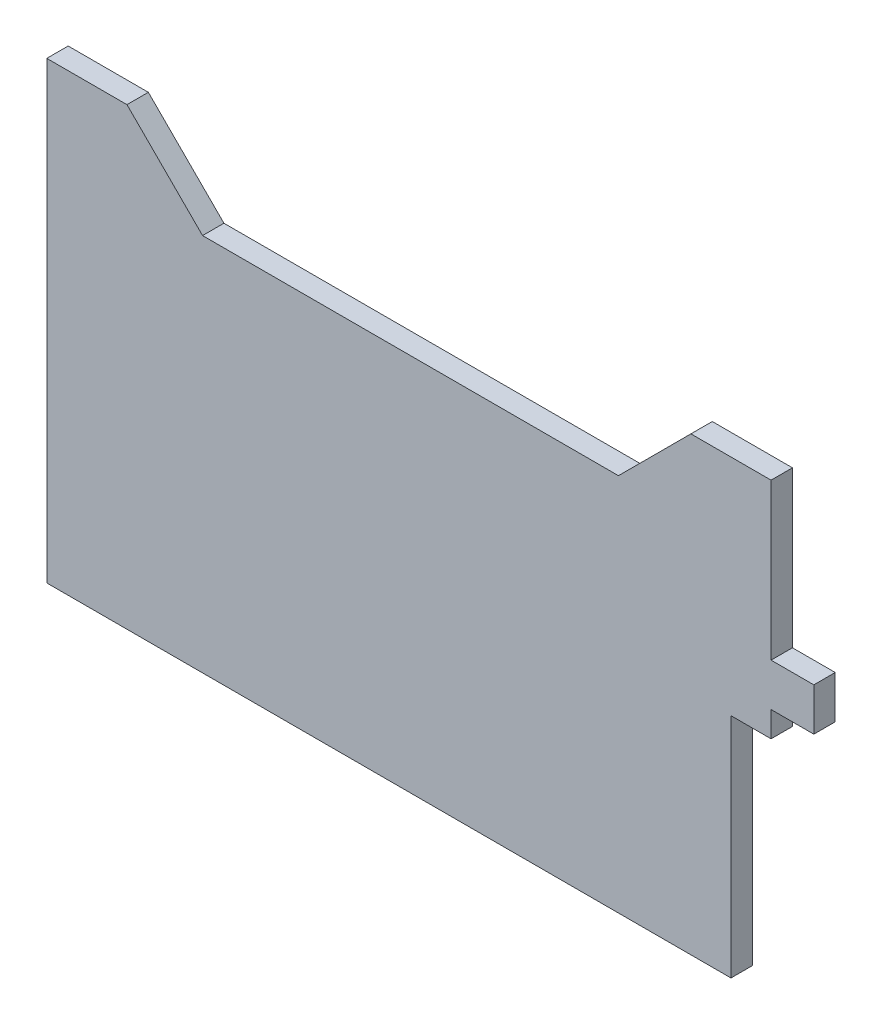
ISO-10303-21;
HEADER;
FILE_DESCRIPTION(('STEP AP214'),'2;1');
FILE_NAME('part.step','',(''),(''),'','','');
FILE_SCHEMA(('AUTOMOTIVE_DESIGN { 1 0 10303 214 1 1 1 1 }'));
ENDSEC;
DATA;
#1=APPLICATION_CONTEXT('core data for automotive mechanical design processes');
#2=APPLICATION_PROTOCOL_DEFINITION('international standard','automotive_design',2000,#1);
#3=PRODUCT_CONTEXT('',#1,'mechanical');
#4=PRODUCT('Part','Part','',(#3));
#5=PRODUCT_RELATED_PRODUCT_CATEGORY('part','',(#4));
#6=PRODUCT_DEFINITION_FORMATION('','',#4);
#7=PRODUCT_DEFINITION_CONTEXT('part definition',#1,'design');
#8=PRODUCT_DEFINITION('design','',#6,#7);
#9=PRODUCT_DEFINITION_SHAPE('','',#8);
#10=(LENGTH_UNIT() NAMED_UNIT(*) SI_UNIT(.MILLI.,.METRE.));
#11=(NAMED_UNIT(*) PLANE_ANGLE_UNIT() SI_UNIT($,.RADIAN.));
#12=(NAMED_UNIT(*) SI_UNIT($,.STERADIAN.) SOLID_ANGLE_UNIT());
#13=UNCERTAINTY_MEASURE_WITH_UNIT(LENGTH_MEASURE(1.E-05),#10,'distance_accuracy_value','');
#14=(GEOMETRIC_REPRESENTATION_CONTEXT(3) GLOBAL_UNCERTAINTY_ASSIGNED_CONTEXT((#13)) GLOBAL_UNIT_ASSIGNED_CONTEXT((#10,
#11,#12)) REPRESENTATION_CONTEXT('',''));
#15=CARTESIAN_POINT('',(0.,0.,0.));
#16=DIRECTION('',(0.,0.,1.));
#17=DIRECTION('',(1.,0.,0.));
#18=AXIS2_PLACEMENT_3D('',#15,#16,#17);
#19=CARTESIAN_POINT('',(62.5,19.450893004236,4.));
#20=DIRECTION('',(0.,1.,0.));
#21=DIRECTION('',(0.,0.,1.));
#22=AXIS2_PLACEMENT_3D('',#19,#20,#21);
#23=PLANE('',#22);
#24=DIRECTION('',(1.,0.,0.));
#25=VECTOR('',#24,1.);
#26=CARTESIAN_POINT('',(62.5,19.450893004236,0.));
#27=LINE('',#26,#25);
#28=CARTESIAN_POINT('',(54.5,19.450893004236,0.));
#29=VERTEX_POINT('',#28);
#30=CARTESIAN_POINT('',(62.5,19.450893004236,0.));
#31=VERTEX_POINT('',#30);
#32=EDGE_CURVE('E133',#29,#31,#27,.T.);
#33=ORIENTED_EDGE('',*,*,#32,.T.);
#34=DIRECTION('',(0.,0.,-1.));
#35=VECTOR('',#34,1.);
#36=CARTESIAN_POINT('',(62.5,19.450893004236,4.));
#37=LINE('',#36,#35);
#38=CARTESIAN_POINT('',(62.5,19.450893004236,4.));
#39=VERTEX_POINT('',#38);
#40=EDGE_CURVE('E11',#39,#31,#37,.T.);
#41=ORIENTED_EDGE('',*,*,#40,.F.);
#42=DIRECTION('',(1.,0.,0.));
#43=VECTOR('',#42,1.);
#44=CARTESIAN_POINT('',(62.5,19.450893004236,4.));
#45=LINE('',#44,#43);
#46=CARTESIAN_POINT('',(54.5,19.450893004236,4.));
#47=VERTEX_POINT('',#46);
#48=EDGE_CURVE('E151',#47,#39,#45,.T.);
#49=ORIENTED_EDGE('',*,*,#48,.F.);
#50=DIRECTION('',(0.,0.,-1.));
#51=VECTOR('',#50,1.);
#52=CARTESIAN_POINT('',(54.5,19.450893004236,4.));
#53=LINE('',#52,#51);
#54=EDGE_CURVE('E129',#47,#29,#53,.T.);
#55=ORIENTED_EDGE('',*,*,#54,.T.);
#56=EDGE_LOOP('',(#33,#41,#49,#55));
#57=FACE_BOUND('',#56,.T.);
#58=ADVANCED_FACE('F33',(#57),#23,.F.);
#59=CARTESIAN_POINT('',(62.5,27.450893004236,4.));
#60=DIRECTION('',(-1.,0.,0.));
#61=DIRECTION('',(0.,0.,1.));
#62=AXIS2_PLACEMENT_3D('',#59,#60,#61);
#63=PLANE('',#62);
#64=DIRECTION('',(0.,1.,0.));
#65=VECTOR('',#64,1.);
#66=CARTESIAN_POINT('',(62.5,27.450893004236,0.));
#67=LINE('',#66,#65);
#68=CARTESIAN_POINT('',(62.5,27.450893004236,0.));
#69=VERTEX_POINT('',#68);
#70=EDGE_CURVE('E136',#31,#69,#67,.T.);
#71=ORIENTED_EDGE('',*,*,#70,.T.);
#72=DIRECTION('',(0.,0.,-1.));
#73=VECTOR('',#72,1.);
#74=CARTESIAN_POINT('',(62.5,27.450893004236,4.));
#75=LINE('',#74,#73);
#76=CARTESIAN_POINT('',(62.5,27.450893004236,4.));
#77=VERTEX_POINT('',#76);
#78=EDGE_CURVE('E41',#77,#69,#75,.T.);
#79=ORIENTED_EDGE('',*,*,#78,.F.);
#80=DIRECTION('',(0.,1.,0.));
#81=VECTOR('',#80,1.);
#82=CARTESIAN_POINT('',(62.5,27.450893004236,4.));
#83=LINE('',#82,#81);
#84=EDGE_CURVE('E93',#39,#77,#83,.T.);
#85=ORIENTED_EDGE('',*,*,#84,.F.);
#86=ORIENTED_EDGE('',*,*,#40,.T.);
#87=EDGE_LOOP('',(#71,#79,#85,#86));
#88=FACE_BOUND('',#87,.T.);
#89=ADVANCED_FACE('F232',(#88),#63,.F.);
#90=CARTESIAN_POINT('',(54.5,27.450893004236,4.));
#91=DIRECTION('',(0.,-1.,0.));
#92=DIRECTION('',(0.,0.,-1.));
#93=AXIS2_PLACEMENT_3D('',#90,#91,#92);
#94=PLANE('',#93);
#95=DIRECTION('',(-1.,0.,0.));
#96=VECTOR('',#95,1.);
#97=CARTESIAN_POINT('',(54.5,27.450893004236,0.));
#98=LINE('',#97,#96);
#99=CARTESIAN_POINT('',(54.5,27.450893004236,0.));
#100=VERTEX_POINT('',#99);
#101=EDGE_CURVE('E139',#69,#100,#98,.T.);
#102=ORIENTED_EDGE('',*,*,#101,.T.);
#103=DIRECTION('',(0.,0.,-1.));
#104=VECTOR('',#103,1.);
#105=CARTESIAN_POINT('',(54.5,27.450893004236,4.));
#106=LINE('',#105,#104);
#107=CARTESIAN_POINT('',(54.5,27.450893004236,4.));
#108=VERTEX_POINT('',#107);
#109=EDGE_CURVE('E158',#108,#100,#106,.T.);
#110=ORIENTED_EDGE('',*,*,#109,.F.);
#111=DIRECTION('',(-1.,0.,0.));
#112=VECTOR('',#111,1.);
#113=CARTESIAN_POINT('',(54.5,27.450893004236,4.));
#114=LINE('',#113,#112);
#115=EDGE_CURVE('E166',#77,#108,#114,.T.);
#116=ORIENTED_EDGE('',*,*,#115,.F.);
#117=ORIENTED_EDGE('',*,*,#78,.T.);
#118=EDGE_LOOP('',(#102,#110,#116,#117));
#119=FACE_BOUND('',#118,.T.);
#120=ADVANCED_FACE('F164',(#119),#94,.F.);
#121=CARTESIAN_POINT('',(54.5,32.200893004236,4.));
#122=DIRECTION('',(-1.,0.,0.));
#123=DIRECTION('',(0.,-1.,0.));
#124=AXIS2_PLACEMENT_3D('',#121,#122,#123);
#125=PLANE('',#124);
#126=DIRECTION('',(0.,1.,0.));
#127=VECTOR('',#126,1.);
#128=CARTESIAN_POINT('',(54.5,32.200893004236,0.));
#129=LINE('',#128,#127);
#130=CARTESIAN_POINT('',(54.5,56.6124319487451,0.));
#131=VERTEX_POINT('',#130);
#132=EDGE_CURVE('E141',#100,#131,#129,.T.);
#133=ORIENTED_EDGE('',*,*,#132,.T.);
#134=DIRECTION('',(0.,0.,-1.));
#135=VECTOR('',#134,1.);
#136=CARTESIAN_POINT('',(54.5,56.6124319487451,4.));
#137=LINE('',#136,#135);
#138=CARTESIAN_POINT('',(54.5,56.6124319487451,4.));
#139=VERTEX_POINT('',#138);
#140=EDGE_CURVE('E137',#139,#131,#137,.T.);
#141=ORIENTED_EDGE('',*,*,#140,.F.);
#142=DIRECTION('',(0.,1.,0.));
#143=VECTOR('',#142,1.);
#144=CARTESIAN_POINT('',(54.5,32.200893004236,4.));
#145=LINE('',#144,#143);
#146=EDGE_CURVE('E200',#108,#139,#145,.T.);
#147=ORIENTED_EDGE('',*,*,#146,.F.);
#148=ORIENTED_EDGE('',*,*,#109,.T.);
#149=EDGE_LOOP('',(#133,#141,#147,#148));
#150=FACE_BOUND('',#149,.T.);
#151=ADVANCED_FACE('F179',(#150),#125,.F.);
#152=CARTESIAN_POINT('',(-81.,-27.799106995764,4.));
#153=DIRECTION('',(1.,0.,0.));
#154=DIRECTION('',(0.,0.,-1.));
#155=AXIS2_PLACEMENT_3D('',#152,#153,#154);
#156=PLANE('',#155);
#157=DIRECTION('',(0.,-1.,0.));
#158=VECTOR('',#157,1.);
#159=CARTESIAN_POINT('',(-81.,-27.799106995764,0.));
#160=LINE('',#159,#158);
#161=CARTESIAN_POINT('',(-81.,57.200893004236,0.));
#162=VERTEX_POINT('',#161);
#163=CARTESIAN_POINT('',(-81.,-27.799106995764,0.));
#164=VERTEX_POINT('',#163);
#165=EDGE_CURVE('E144',#162,#164,#160,.T.);
#166=ORIENTED_EDGE('',*,*,#165,.T.);
#167=DIRECTION('',(0.,0.,-1.));
#168=VECTOR('',#167,1.);
#169=CARTESIAN_POINT('',(-81.,-27.799106995764,4.));
#170=LINE('',#169,#168);
#171=CARTESIAN_POINT('',(-81.,-27.799106995764,4.));
#172=VERTEX_POINT('',#171);
#173=EDGE_CURVE('E155',#172,#164,#170,.T.);
#174=ORIENTED_EDGE('',*,*,#173,.F.);
#175=DIRECTION('',(0.,-1.,0.));
#176=VECTOR('',#175,1.);
#177=CARTESIAN_POINT('',(-81.,-27.799106995764,4.));
#178=LINE('',#177,#176);
#179=CARTESIAN_POINT('',(-81.,57.200893004236,4.));
#180=VERTEX_POINT('',#179);
#181=EDGE_CURVE('E203',#180,#172,#178,.T.);
#182=ORIENTED_EDGE('',*,*,#181,.F.);
#183=DIRECTION('',(0.,0.,-1.));
#184=VECTOR('',#183,1.);
#185=CARTESIAN_POINT('',(-81.,57.200893004236,4.));
#186=LINE('',#185,#184);
#187=EDGE_CURVE('E345',#180,#162,#186,.T.);
#188=ORIENTED_EDGE('',*,*,#187,.T.);
#189=EDGE_LOOP('',(#166,#174,#182,#188));
#190=FACE_BOUND('',#189,.T.);
#191=ADVANCED_FACE('F213',(#190),#156,.F.);
#192=CARTESIAN_POINT('',(-81.,-27.799106995764,4.));
#193=DIRECTION('',(0.,1.,0.));
#194=DIRECTION('',(0.,0.,1.));
#195=AXIS2_PLACEMENT_3D('',#192,#193,#194);
#196=PLANE('',#195);
#197=DIRECTION('',(1.,0.,0.));
#198=VECTOR('',#197,1.);
#199=CARTESIAN_POINT('',(-81.,-27.799106995764,0.));
#200=LINE('',#199,#198);
#201=CARTESIAN_POINT('',(47.,-27.799106995764,0.));
#202=VERTEX_POINT('',#201);
#203=EDGE_CURVE('E146',#164,#202,#200,.T.);
#204=ORIENTED_EDGE('',*,*,#203,.T.);
#205=DIRECTION('',(0.,0.,-1.));
#206=VECTOR('',#205,1.);
#207=CARTESIAN_POINT('',(47.,-27.799106995764,4.));
#208=LINE('',#207,#206);
#209=CARTESIAN_POINT('',(47.,-27.799106995764,4.));
#210=VERTEX_POINT('',#209);
#211=EDGE_CURVE('E124',#210,#202,#208,.T.);
#212=ORIENTED_EDGE('',*,*,#211,.F.);
#213=DIRECTION('',(1.,0.,0.));
#214=VECTOR('',#213,1.);
#215=CARTESIAN_POINT('',(-81.,-27.799106995764,4.));
#216=LINE('',#215,#214);
#217=EDGE_CURVE('E115',#172,#210,#216,.T.);
#218=ORIENTED_EDGE('',*,*,#217,.F.);
#219=ORIENTED_EDGE('',*,*,#173,.T.);
#220=EDGE_LOOP('',(#204,#212,#218,#219));
#221=FACE_BOUND('',#220,.T.);
#222=ADVANCED_FACE('F217',(#221),#196,.F.);
#223=CARTESIAN_POINT('',(47.,14.700893004236,4.));
#224=DIRECTION('',(-1.,0.,0.));
#225=DIRECTION('',(0.,0.,1.));
#226=AXIS2_PLACEMENT_3D('',#223,#224,#225);
#227=PLANE('',#226);
#228=DIRECTION('',(0.,1.,0.));
#229=VECTOR('',#228,1.);
#230=CARTESIAN_POINT('',(47.,14.700893004236,0.));
#231=LINE('',#230,#229);
#232=CARTESIAN_POINT('',(47.,14.700893004236,0.));
#233=VERTEX_POINT('',#232);
#234=EDGE_CURVE('E123',#202,#233,#231,.T.);
#235=ORIENTED_EDGE('',*,*,#234,.T.);
#236=DIRECTION('',(0.,0.,-1.));
#237=VECTOR('',#236,1.);
#238=CARTESIAN_POINT('',(47.,14.700893004236,4.));
#239=LINE('',#238,#237);
#240=CARTESIAN_POINT('',(47.,14.700893004236,4.));
#241=VERTEX_POINT('',#240);
#242=EDGE_CURVE('E120',#241,#233,#239,.T.);
#243=ORIENTED_EDGE('',*,*,#242,.F.);
#244=DIRECTION('',(0.,1.,0.));
#245=VECTOR('',#244,1.);
#246=CARTESIAN_POINT('',(47.,14.700893004236,4.));
#247=LINE('',#246,#245);
#248=EDGE_CURVE('E109',#210,#241,#247,.T.);
#249=ORIENTED_EDGE('',*,*,#248,.F.);
#250=ORIENTED_EDGE('',*,*,#211,.T.);
#251=EDGE_LOOP('',(#235,#243,#249,#250));
#252=FACE_BOUND('',#251,.T.);
#253=ADVANCED_FACE('F121',(#252),#227,.F.);
#254=CARTESIAN_POINT('',(54.5,14.700893004236,4.));
#255=DIRECTION('',(0.,1.,0.));
#256=DIRECTION('',(0.,0.,1.));
#257=AXIS2_PLACEMENT_3D('',#254,#255,#256);
#258=PLANE('',#257);
#259=DIRECTION('',(1.,0.,0.));
#260=VECTOR('',#259,1.);
#261=CARTESIAN_POINT('',(54.5,14.700893004236,0.));
#262=LINE('',#261,#260);
#263=CARTESIAN_POINT('',(54.5,14.700893004236,0.));
#264=VERTEX_POINT('',#263);
#265=EDGE_CURVE('E79',#233,#264,#262,.T.);
#266=ORIENTED_EDGE('',*,*,#265,.T.);
#267=DIRECTION('',(0.,0.,-1.));
#268=VECTOR('',#267,1.);
#269=CARTESIAN_POINT('',(54.5,14.700893004236,4.));
#270=LINE('',#269,#268);
#271=CARTESIAN_POINT('',(54.5,14.700893004236,4.));
#272=VERTEX_POINT('',#271);
#273=EDGE_CURVE('E125',#272,#264,#270,.T.);
#274=ORIENTED_EDGE('',*,*,#273,.F.);
#275=DIRECTION('',(1.,0.,0.));
#276=VECTOR('',#275,1.);
#277=CARTESIAN_POINT('',(54.5,14.700893004236,4.));
#278=LINE('',#277,#276);
#279=EDGE_CURVE('E113',#241,#272,#278,.T.);
#280=ORIENTED_EDGE('',*,*,#279,.F.);
#281=ORIENTED_EDGE('',*,*,#242,.T.);
#282=EDGE_LOOP('',(#266,#274,#280,#281));
#283=FACE_BOUND('',#282,.T.);
#284=ADVANCED_FACE('F127',(#283),#258,.F.);
#285=CARTESIAN_POINT('',(54.5,19.450893004236,4.));
#286=DIRECTION('',(-1.,0.,0.));
#287=DIRECTION('',(0.,0.,1.));
#288=AXIS2_PLACEMENT_3D('',#285,#286,#287);
#289=PLANE('',#288);
#290=DIRECTION('',(0.,1.,0.));
#291=VECTOR('',#290,1.);
#292=CARTESIAN_POINT('',(54.5,19.450893004236,0.));
#293=LINE('',#292,#291);
#294=EDGE_CURVE('E85',#264,#29,#293,.T.);
#295=ORIENTED_EDGE('',*,*,#294,.T.);
#296=ORIENTED_EDGE('',*,*,#54,.F.);
#297=DIRECTION('',(0.,1.,0.));
#298=VECTOR('',#297,1.);
#299=CARTESIAN_POINT('',(54.5,19.450893004236,4.));
#300=LINE('',#299,#298);
#301=EDGE_CURVE('E49',#272,#47,#300,.T.);
#302=ORIENTED_EDGE('',*,*,#301,.F.);
#303=ORIENTED_EDGE('',*,*,#273,.T.);
#304=EDGE_LOOP('',(#295,#296,#302,#303));
#305=FACE_BOUND('',#304,.T.);
#306=ADVANCED_FACE('F221',(#305),#289,.F.);
#307=CARTESIAN_POINT('',(0.,0.,4.));
#308=DIRECTION('',(0.,0.,1.));
#309=DIRECTION('',(1.,0.,0.));
#310=AXIS2_PLACEMENT_3D('',#307,#308,#309);
#311=PLANE('',#310);
#312=ORIENTED_EDGE('',*,*,#48,.T.);
#313=ORIENTED_EDGE('',*,*,#84,.T.);
#314=ORIENTED_EDGE('',*,*,#115,.T.);
#315=ORIENTED_EDGE('',*,*,#146,.T.);
#316=DIRECTION('',(-1.,0.,0.));
#317=VECTOR('',#316,1.);
#318=CARTESIAN_POINT('',(54.5,56.6124319487451,4.));
#319=LINE('',#318,#317);
#320=CARTESIAN_POINT('',(39.5,56.6124319487451,4.));
#321=VERTEX_POINT('',#320);
#322=EDGE_CURVE('E190',#139,#321,#319,.T.);
#323=ORIENTED_EDGE('',*,*,#322,.T.);
#324=DIRECTION('',(-0.707106781186549,-0.707106781186547,0.));
#325=VECTOR('',#324,1.);
#326=CARTESIAN_POINT('',(39.5,56.6124319487451,4.));
#327=LINE('',#326,#325);
#328=CARTESIAN_POINT('',(25.9463254317599,43.0587573805051,4.));
#329=VERTEX_POINT('',#328);
#330=EDGE_CURVE('E383',#321,#329,#327,.T.);
#331=ORIENTED_EDGE('',*,*,#330,.T.);
#332=DIRECTION('',(-1.,0.,0.));
#333=VECTOR('',#332,1.);
#334=CARTESIAN_POINT('',(25.9463254317599,43.0587573805051,4.));
#335=LINE('',#334,#333);
#336=CARTESIAN_POINT('',(-51.8578643762691,43.0587573805051,4.));
#337=VERTEX_POINT('',#336);
#338=EDGE_CURVE('E371',#329,#337,#335,.T.);
#339=ORIENTED_EDGE('',*,*,#338,.T.);
#340=DIRECTION('',(-0.707106781186546,0.707106781186549,0.));
#341=VECTOR('',#340,1.);
#342=CARTESIAN_POINT('',(-51.8578643762691,43.0587573805051,4.));
#343=LINE('',#342,#341);
#344=CARTESIAN_POINT('',(-66.,57.200893004236,4.));
#345=VERTEX_POINT('',#344);
#346=EDGE_CURVE('E355',#337,#345,#343,.T.);
#347=ORIENTED_EDGE('',*,*,#346,.T.);
#348=DIRECTION('',(-1.,0.,0.));
#349=VECTOR('',#348,1.);
#350=CARTESIAN_POINT('',(-66.,57.200893004236,4.));
#351=LINE('',#350,#349);
#352=EDGE_CURVE('E209',#345,#180,#351,.T.);
#353=ORIENTED_EDGE('',*,*,#352,.T.);
#354=ORIENTED_EDGE('',*,*,#181,.T.);
#355=ORIENTED_EDGE('',*,*,#217,.T.);
#356=ORIENTED_EDGE('',*,*,#248,.T.);
#357=ORIENTED_EDGE('',*,*,#279,.T.);
#358=ORIENTED_EDGE('',*,*,#301,.T.);
#359=EDGE_LOOP('',(#312,#313,#314,#315,#323,#331,#339,#347,#353,#354,#355,#356,#357,#358));
#360=FACE_BOUND('',#359,.T.);
#361=ADVANCED_FACE('F111',(#360),#311,.T.);
#362=CARTESIAN_POINT('',(0.,0.,0.));
#363=DIRECTION('',(0.,0.,1.));
#364=DIRECTION('',(1.,0.,0.));
#365=AXIS2_PLACEMENT_3D('',#362,#363,#364);
#366=PLANE('',#365);
#367=ORIENTED_EDGE('',*,*,#32,.F.);
#368=ORIENTED_EDGE('',*,*,#294,.F.);
#369=ORIENTED_EDGE('',*,*,#265,.F.);
#370=ORIENTED_EDGE('',*,*,#234,.F.);
#371=ORIENTED_EDGE('',*,*,#203,.F.);
#372=ORIENTED_EDGE('',*,*,#165,.F.);
#373=DIRECTION('',(-1.,0.,0.));
#374=VECTOR('',#373,1.);
#375=CARTESIAN_POINT('',(-66.,57.200893004236,0.));
#376=LINE('',#375,#374);
#377=CARTESIAN_POINT('',(-66.,57.200893004236,0.));
#378=VERTEX_POINT('',#377);
#379=EDGE_CURVE('E344',#378,#162,#376,.T.);
#380=ORIENTED_EDGE('',*,*,#379,.F.);
#381=DIRECTION('',(-0.707106781186546,0.707106781186549,0.));
#382=VECTOR('',#381,1.);
#383=CARTESIAN_POINT('',(-51.8578643762691,43.0587573805051,0.));
#384=LINE('',#383,#382);
#385=CARTESIAN_POINT('',(-51.8578643762691,43.0587573805051,0.));
#386=VERTEX_POINT('',#385);
#387=EDGE_CURVE('E350',#386,#378,#384,.T.);
#388=ORIENTED_EDGE('',*,*,#387,.F.);
#389=DIRECTION('',(-1.,0.,0.));
#390=VECTOR('',#389,1.);
#391=CARTESIAN_POINT('',(25.9463254317599,43.0587573805051,0.));
#392=LINE('',#391,#390);
#393=CARTESIAN_POINT('',(25.9463254317599,43.0587573805051,0.));
#394=VERTEX_POINT('',#393);
#395=EDGE_CURVE('E368',#394,#386,#392,.T.);
#396=ORIENTED_EDGE('',*,*,#395,.F.);
#397=DIRECTION('',(-0.707106781186549,-0.707106781186547,0.));
#398=VECTOR('',#397,1.);
#399=CARTESIAN_POINT('',(39.5,56.6124319487451,0.));
#400=LINE('',#399,#398);
#401=CARTESIAN_POINT('',(39.5,56.6124319487451,0.));
#402=VERTEX_POINT('',#401);
#403=EDGE_CURVE('E375',#402,#394,#400,.T.);
#404=ORIENTED_EDGE('',*,*,#403,.F.);
#405=DIRECTION('',(-1.,0.,0.));
#406=VECTOR('',#405,1.);
#407=CARTESIAN_POINT('',(54.5,56.6124319487451,0.));
#408=LINE('',#407,#406);
#409=EDGE_CURVE('E175',#131,#402,#408,.T.);
#410=ORIENTED_EDGE('',*,*,#409,.F.);
#411=ORIENTED_EDGE('',*,*,#132,.F.);
#412=ORIENTED_EDGE('',*,*,#101,.F.);
#413=ORIENTED_EDGE('',*,*,#70,.F.);
#414=EDGE_LOOP('',(#367,#368,#369,#370,#371,#372,#380,#388,#396,#404,#410,#411,#412,#413));
#415=FACE_BOUND('',#414,.T.);
#416=ADVANCED_FACE('F170',(#415),#366,.F.);
#417=CARTESIAN_POINT('',(54.5,56.6124319487451,4.));
#418=DIRECTION('',(0.,-1.,0.));
#419=DIRECTION('',(0.,0.,-1.));
#420=AXIS2_PLACEMENT_3D('',#417,#418,#419);
#421=PLANE('',#420);
#422=ORIENTED_EDGE('',*,*,#409,.T.);
#423=DIRECTION('',(0.,0.,-1.));
#424=VECTOR('',#423,1.);
#425=CARTESIAN_POINT('',(39.5,56.6124319487451,4.));
#426=LINE('',#425,#424);
#427=EDGE_CURVE('E191',#321,#402,#426,.T.);
#428=ORIENTED_EDGE('',*,*,#427,.F.);
#429=ORIENTED_EDGE('',*,*,#322,.F.);
#430=ORIENTED_EDGE('',*,*,#140,.T.);
#431=EDGE_LOOP('',(#422,#428,#429,#430));
#432=FACE_BOUND('',#431,.T.);
#433=ADVANCED_FACE('F186',(#432),#421,.F.);
#434=CARTESIAN_POINT('',(39.5,56.6124319487451,4.));
#435=DIRECTION('',(0.707106781186547,-0.707106781186549,0.));
#436=DIRECTION('',(0.707106781186549,0.707106781186547,0.));
#437=AXIS2_PLACEMENT_3D('',#434,#435,#436);
#438=PLANE('',#437);
#439=ORIENTED_EDGE('',*,*,#403,.T.);
#440=DIRECTION('',(0.,0.,-1.));
#441=VECTOR('',#440,1.);
#442=CARTESIAN_POINT('',(25.9463254317599,43.0587573805051,4.));
#443=LINE('',#442,#441);
#444=EDGE_CURVE('E193',#329,#394,#443,.T.);
#445=ORIENTED_EDGE('',*,*,#444,.F.);
#446=ORIENTED_EDGE('',*,*,#330,.F.);
#447=ORIENTED_EDGE('',*,*,#427,.T.);
#448=EDGE_LOOP('',(#439,#445,#446,#447));
#449=FACE_BOUND('',#448,.T.);
#450=ADVANCED_FACE('F298',(#449),#438,.F.);
#451=CARTESIAN_POINT('',(25.9463254317599,43.0587573805051,4.));
#452=DIRECTION('',(0.,-1.,0.));
#453=DIRECTION('',(1.,0.,0.));
#454=AXIS2_PLACEMENT_3D('',#451,#452,#453);
#455=PLANE('',#454);
#456=ORIENTED_EDGE('',*,*,#395,.T.);
#457=DIRECTION('',(0.,0.,-1.));
#458=VECTOR('',#457,1.);
#459=CARTESIAN_POINT('',(-51.8578643762691,43.0587573805051,4.));
#460=LINE('',#459,#458);
#461=EDGE_CURVE('E353',#337,#386,#460,.T.);
#462=ORIENTED_EDGE('',*,*,#461,.F.);
#463=ORIENTED_EDGE('',*,*,#338,.F.);
#464=ORIENTED_EDGE('',*,*,#444,.T.);
#465=EDGE_LOOP('',(#456,#462,#463,#464));
#466=FACE_BOUND('',#465,.T.);
#467=ADVANCED_FACE('F307',(#466),#455,.F.);
#468=CARTESIAN_POINT('',(-51.8578643762691,43.0587573805051,4.));
#469=DIRECTION('',(-0.707106781186549,-0.707106781186546,0.));
#470=DIRECTION('',(0.707106781186546,-0.707106781186549,0.));
#471=AXIS2_PLACEMENT_3D('',#468,#469,#470);
#472=PLANE('',#471);
#473=ORIENTED_EDGE('',*,*,#387,.T.);
#474=DIRECTION('',(0.,0.,-1.));
#475=VECTOR('',#474,1.);
#476=CARTESIAN_POINT('',(-66.,57.200893004236,4.));
#477=LINE('',#476,#475);
#478=EDGE_CURVE('E348',#345,#378,#477,.T.);
#479=ORIENTED_EDGE('',*,*,#478,.F.);
#480=ORIENTED_EDGE('',*,*,#346,.F.);
#481=ORIENTED_EDGE('',*,*,#461,.T.);
#482=EDGE_LOOP('',(#473,#479,#480,#481));
#483=FACE_BOUND('',#482,.T.);
#484=ADVANCED_FACE('F317',(#483),#472,.F.);
#485=CARTESIAN_POINT('',(-66.,57.200893004236,4.));
#486=DIRECTION('',(0.,-1.,0.));
#487=DIRECTION('',(0.,0.,-1.));
#488=AXIS2_PLACEMENT_3D('',#485,#486,#487);
#489=PLANE('',#488);
#490=ORIENTED_EDGE('',*,*,#379,.T.);
#491=ORIENTED_EDGE('',*,*,#187,.F.);
#492=ORIENTED_EDGE('',*,*,#352,.F.);
#493=ORIENTED_EDGE('',*,*,#478,.T.);
#494=EDGE_LOOP('',(#490,#491,#492,#493));
#495=FACE_BOUND('',#494,.T.);
#496=ADVANCED_FACE('F327',(#495),#489,.F.);
#497=CLOSED_SHELL('',(#58,#89,#120,#151,#191,#222,#253,#284,#306,#361,#416,#433,#450,#467,#484,#496));
#498=MANIFOLD_SOLID_BREP('B2',#497);
#499=ADVANCED_BREP_SHAPE_REPRESENTATION('',(#18,#498),#14);
#500=SHAPE_DEFINITION_REPRESENTATION(#9,#499);
ENDSEC;
END-ISO-10303-21;
